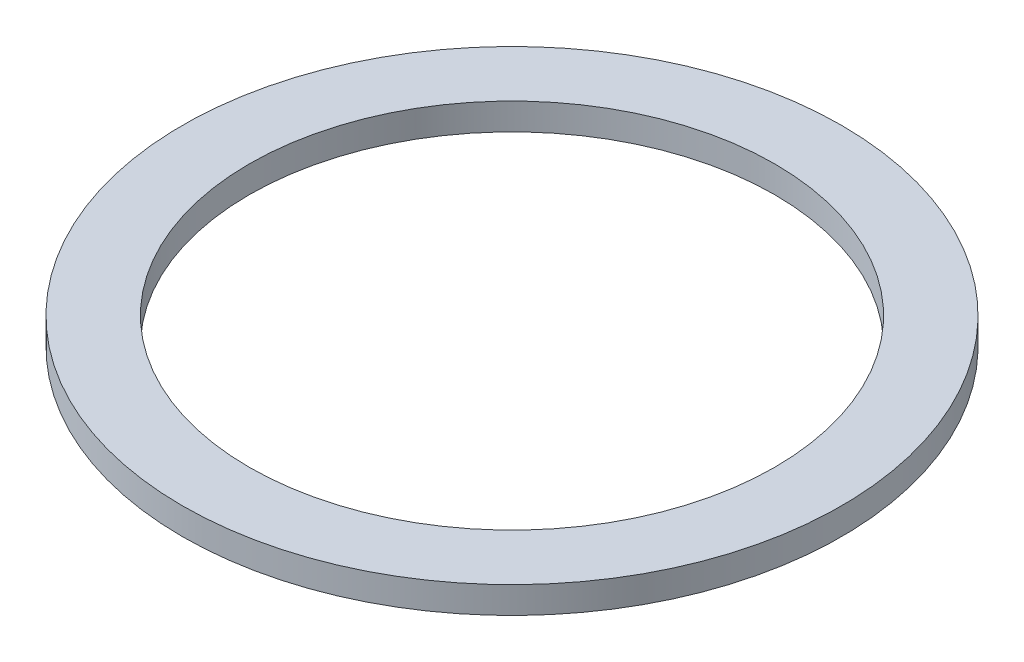
ISO-10303-21;
HEADER;
FILE_DESCRIPTION(('STEP AP214'),'2;1');
FILE_NAME('part.step','',(''),(''),'','','');
FILE_SCHEMA(('AUTOMOTIVE_DESIGN { 1 0 10303 214 1 1 1 1 }'));
ENDSEC;
DATA;
#1=APPLICATION_CONTEXT('core data for automotive mechanical design processes');
#2=APPLICATION_PROTOCOL_DEFINITION('international standard','automotive_design',2000,#1);
#3=PRODUCT_CONTEXT('',#1,'mechanical');
#4=PRODUCT('Part','Part','',(#3));
#5=PRODUCT_RELATED_PRODUCT_CATEGORY('part','',(#4));
#6=PRODUCT_DEFINITION_FORMATION('','',#4);
#7=PRODUCT_DEFINITION_CONTEXT('part definition',#1,'design');
#8=PRODUCT_DEFINITION('design','',#6,#7);
#9=PRODUCT_DEFINITION_SHAPE('','',#8);
#10=(LENGTH_UNIT() NAMED_UNIT(*) SI_UNIT(.MILLI.,.METRE.));
#11=(NAMED_UNIT(*) PLANE_ANGLE_UNIT() SI_UNIT($,.RADIAN.));
#12=(NAMED_UNIT(*) SI_UNIT($,.STERADIAN.) SOLID_ANGLE_UNIT());
#13=UNCERTAINTY_MEASURE_WITH_UNIT(LENGTH_MEASURE(1.E-05),#10,'distance_accuracy_value','');
#14=(GEOMETRIC_REPRESENTATION_CONTEXT(3) GLOBAL_UNCERTAINTY_ASSIGNED_CONTEXT((#13)) GLOBAL_UNIT_ASSIGNED_CONTEXT((#10,
#11,#12)) REPRESENTATION_CONTEXT('',''));
#15=CARTESIAN_POINT('',(0.,0.,0.));
#16=DIRECTION('',(0.,0.,1.));
#17=DIRECTION('',(1.,0.,0.));
#18=AXIS2_PLACEMENT_3D('',#15,#16,#17);
#19=CARTESIAN_POINT('',(0.,0.6,0.));
#20=DIRECTION('',(0.,1.,0.));
#21=DIRECTION('',(0.,0.,1.));
#22=AXIS2_PLACEMENT_3D('',#19,#20,#21);
#23=PLANE('',#22);
#24=CARTESIAN_POINT('',(0.,0.6,0.));
#25=DIRECTION('',(0.,1.,0.));
#26=DIRECTION('',(0.,0.,1.));
#27=AXIS2_PLACEMENT_3D('',#24,#25,#26);
#28=CIRCLE('',#27,14.8);
#29=CARTESIAN_POINT('',(0.,0.6,14.8));
#30=VERTEX_POINT('',#29);
#31=EDGE_CURVE('E10',#30,#30,#28,.T.);
#32=ORIENTED_EDGE('',*,*,#31,.T.);
#33=EDGE_LOOP('',(#32));
#34=FACE_BOUND('',#33,.T.);
#35=CARTESIAN_POINT('',(0.,0.6,0.));
#36=DIRECTION('',(0.,1.,0.));
#37=DIRECTION('',(0.,0.,1.));
#38=AXIS2_PLACEMENT_3D('',#35,#36,#37);
#39=CIRCLE('',#38,11.8);
#40=CARTESIAN_POINT('',(0.,0.6,11.8));
#41=VERTEX_POINT('',#40);
#42=EDGE_CURVE('E41',#41,#41,#39,.T.);
#43=ORIENTED_EDGE('',*,*,#42,.F.);
#44=EDGE_LOOP('',(#43));
#45=FACE_BOUND('',#44,.T.);
#46=ADVANCED_FACE('F30',(#34,#45),#23,.T.);
#47=CARTESIAN_POINT('',(0.,-0.6,0.));
#48=DIRECTION('',(0.,1.,0.));
#49=DIRECTION('',(0.,0.,1.));
#50=AXIS2_PLACEMENT_3D('',#47,#48,#49);
#51=PLANE('',#50);
#52=CARTESIAN_POINT('',(0.,-0.6,0.));
#53=DIRECTION('',(0.,1.,0.));
#54=DIRECTION('',(0.,0.,1.));
#55=AXIS2_PLACEMENT_3D('',#52,#53,#54);
#56=CIRCLE('',#55,14.8);
#57=CARTESIAN_POINT('',(0.,-0.6,14.8));
#58=VERTEX_POINT('',#57);
#59=EDGE_CURVE('E34',#58,#58,#56,.T.);
#60=ORIENTED_EDGE('',*,*,#59,.F.);
#61=EDGE_LOOP('',(#60));
#62=FACE_BOUND('',#61,.T.);
#63=CARTESIAN_POINT('',(0.,-0.6,0.));
#64=DIRECTION('',(0.,1.,0.));
#65=DIRECTION('',(0.,0.,1.));
#66=AXIS2_PLACEMENT_3D('',#63,#64,#65);
#67=CIRCLE('',#66,11.8);
#68=CARTESIAN_POINT('',(0.,-0.6,11.8));
#69=VERTEX_POINT('',#68);
#70=EDGE_CURVE('E43',#69,#69,#67,.T.);
#71=ORIENTED_EDGE('',*,*,#70,.T.);
#72=EDGE_LOOP('',(#71));
#73=FACE_BOUND('',#72,.T.);
#74=ADVANCED_FACE('F53',(#62,#73),#51,.F.);
#75=CARTESIAN_POINT('',(0.,0.6,0.));
#76=DIRECTION('',(0.,-1.,0.));
#77=DIRECTION('',(0.,0.,-1.));
#78=AXIS2_PLACEMENT_3D('',#75,#76,#77);
#79=CYLINDRICAL_SURFACE('',#78,14.8);
#80=ORIENTED_EDGE('',*,*,#31,.F.);
#81=EDGE_LOOP('',(#80));
#82=FACE_BOUND('',#81,.T.);
#83=ORIENTED_EDGE('',*,*,#59,.T.);
#84=EDGE_LOOP('',(#83));
#85=FACE_BOUND('',#84,.T.);
#86=ADVANCED_FACE('F32',(#82,#85),#79,.T.);
#87=CARTESIAN_POINT('',(0.,0.6,0.));
#88=DIRECTION('',(0.,-1.,0.));
#89=DIRECTION('',(0.,0.,-1.));
#90=AXIS2_PLACEMENT_3D('',#87,#88,#89);
#91=CYLINDRICAL_SURFACE('',#90,11.8);
#92=ORIENTED_EDGE('',*,*,#42,.T.);
#93=EDGE_LOOP('',(#92));
#94=FACE_BOUND('',#93,.T.);
#95=ORIENTED_EDGE('',*,*,#70,.F.);
#96=EDGE_LOOP('',(#95));
#97=FACE_BOUND('',#96,.T.);
#98=ADVANCED_FACE('F49',(#94,#97),#91,.F.);
#99=CLOSED_SHELL('',(#46,#74,#86,#98));
#100=MANIFOLD_SOLID_BREP('B2',#99);
#101=ADVANCED_BREP_SHAPE_REPRESENTATION('',(#18,#100),#14);
#102=SHAPE_DEFINITION_REPRESENTATION(#9,#101);
ENDSEC;
END-ISO-10303-21;
